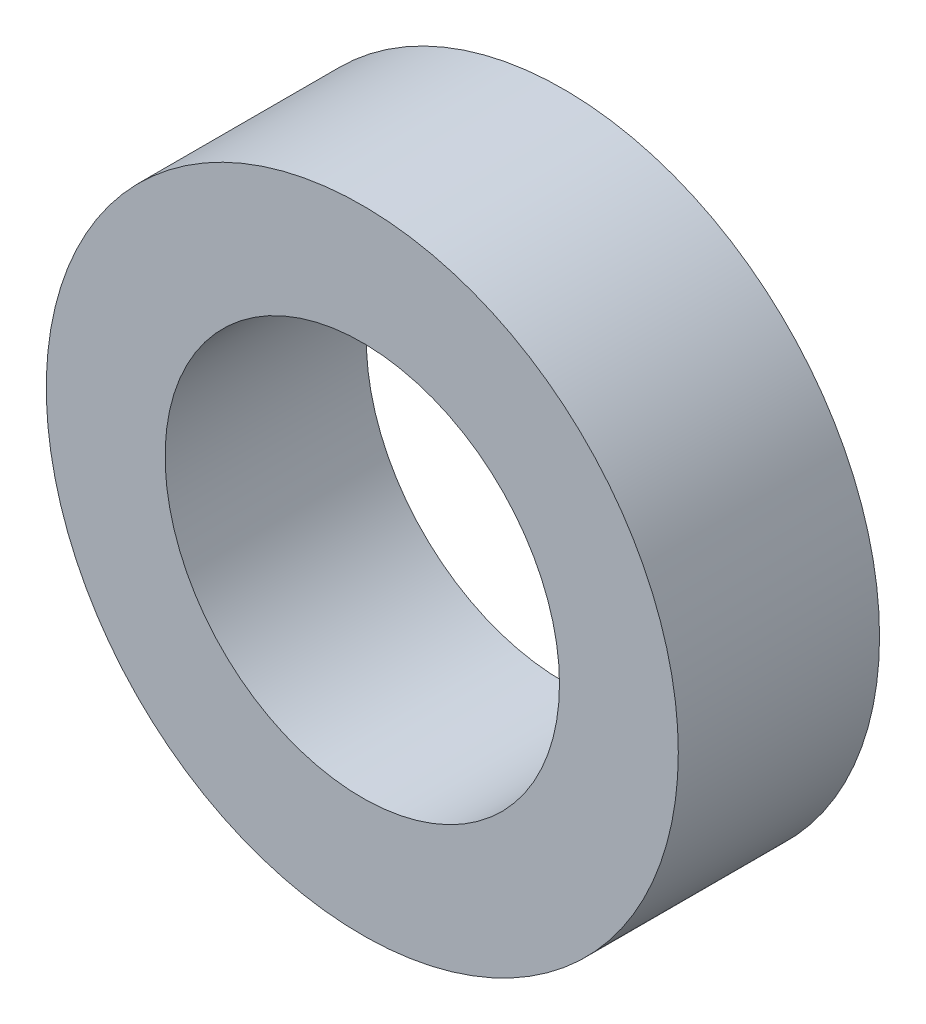
ISO-10303-21;
HEADER;
FILE_DESCRIPTION(('STEP AP214'),'2;1');
FILE_NAME('part.step','',(''),(''),'','','');
FILE_SCHEMA(('AUTOMOTIVE_DESIGN { 1 0 10303 214 1 1 1 1 }'));
ENDSEC;
DATA;
#1=APPLICATION_CONTEXT('core data for automotive mechanical design processes');
#2=APPLICATION_PROTOCOL_DEFINITION('international standard','automotive_design',2000,#1);
#3=PRODUCT_CONTEXT('',#1,'mechanical');
#4=PRODUCT('Part','Part','',(#3));
#5=PRODUCT_RELATED_PRODUCT_CATEGORY('part','',(#4));
#6=PRODUCT_DEFINITION_FORMATION('','',#4);
#7=PRODUCT_DEFINITION_CONTEXT('part definition',#1,'design');
#8=PRODUCT_DEFINITION('design','',#6,#7);
#9=PRODUCT_DEFINITION_SHAPE('','',#8);
#10=(LENGTH_UNIT() NAMED_UNIT(*) SI_UNIT(.MILLI.,.METRE.));
#11=(NAMED_UNIT(*) PLANE_ANGLE_UNIT() SI_UNIT($,.RADIAN.));
#12=(NAMED_UNIT(*) SI_UNIT($,.STERADIAN.) SOLID_ANGLE_UNIT());
#13=UNCERTAINTY_MEASURE_WITH_UNIT(LENGTH_MEASURE(1.E-05),#10,'distance_accuracy_value','');
#14=(GEOMETRIC_REPRESENTATION_CONTEXT(3) GLOBAL_UNCERTAINTY_ASSIGNED_CONTEXT((#13)) GLOBAL_UNIT_ASSIGNED_CONTEXT((#10,
#11,#12)) REPRESENTATION_CONTEXT('',''));
#15=CARTESIAN_POINT('',(0.,0.,0.));
#16=DIRECTION('',(0.,0.,1.));
#17=DIRECTION('',(1.,0.,0.));
#18=AXIS2_PLACEMENT_3D('',#15,#16,#17);
#19=CARTESIAN_POINT('',(0.,0.,10.1092));
#20=DIRECTION('',(0.,0.,1.));
#21=DIRECTION('',(1.,0.,0.));
#22=AXIS2_PLACEMENT_3D('',#19,#20,#21);
#23=PLANE('',#22);
#24=CARTESIAN_POINT('',(0.,0.,10.1092));
#25=DIRECTION('',(0.,0.,1.));
#26=DIRECTION('',(1.,0.,0.));
#27=AXIS2_PLACEMENT_3D('',#24,#25,#26);
#28=CIRCLE('',#27,15.875);
#29=CARTESIAN_POINT('',(15.875,0.,10.1092));
#30=VERTEX_POINT('',#29);
#31=EDGE_CURVE('E10',#30,#30,#28,.T.);
#32=ORIENTED_EDGE('',*,*,#31,.T.);
#33=EDGE_LOOP('',(#32));
#34=FACE_BOUND('',#33,.T.);
#35=CARTESIAN_POINT('',(0.,0.,10.1092));
#36=DIRECTION('',(0.,0.,1.));
#37=DIRECTION('',(1.,0.,0.));
#38=AXIS2_PLACEMENT_3D('',#35,#36,#37);
#39=CIRCLE('',#38,9.906);
#40=CARTESIAN_POINT('',(9.906,0.,10.1092));
#41=VERTEX_POINT('',#40);
#42=EDGE_CURVE('E56',#41,#41,#39,.T.);
#43=ORIENTED_EDGE('',*,*,#42,.F.);
#44=EDGE_LOOP('',(#43));
#45=FACE_BOUND('',#44,.T.);
#46=ADVANCED_FACE('F43',(#34,#45),#23,.T.);
#47=CARTESIAN_POINT('',(0.,0.,0.));
#48=DIRECTION('',(0.,0.,1.));
#49=DIRECTION('',(1.,0.,0.));
#50=AXIS2_PLACEMENT_3D('',#47,#48,#49);
#51=PLANE('',#50);
#52=CARTESIAN_POINT('',(0.,0.,0.));
#53=DIRECTION('',(0.,0.,1.));
#54=DIRECTION('',(1.,0.,0.));
#55=AXIS2_PLACEMENT_3D('',#52,#53,#54);
#56=CIRCLE('',#55,15.875);
#57=CARTESIAN_POINT('',(15.875,0.,0.));
#58=VERTEX_POINT('',#57);
#59=EDGE_CURVE('E47',#58,#58,#56,.T.);
#60=ORIENTED_EDGE('',*,*,#59,.F.);
#61=EDGE_LOOP('',(#60));
#62=FACE_BOUND('',#61,.T.);
#63=CARTESIAN_POINT('',(0.,0.,0.));
#64=DIRECTION('',(0.,0.,1.));
#65=DIRECTION('',(1.,0.,0.));
#66=AXIS2_PLACEMENT_3D('',#63,#64,#65);
#67=CIRCLE('',#66,9.906);
#68=CARTESIAN_POINT('',(9.906,0.,0.));
#69=VERTEX_POINT('',#68);
#70=EDGE_CURVE('E58',#69,#69,#67,.T.);
#71=ORIENTED_EDGE('',*,*,#70,.T.);
#72=EDGE_LOOP('',(#71));
#73=FACE_BOUND('',#72,.T.);
#74=ADVANCED_FACE('F70',(#62,#73),#51,.F.);
#75=CARTESIAN_POINT('',(0.,0.,10.1092));
#76=DIRECTION('',(0.,0.,-1.));
#77=DIRECTION('',(-1.,0.,0.));
#78=AXIS2_PLACEMENT_3D('',#75,#76,#77);
#79=CYLINDRICAL_SURFACE('',#78,15.875);
#80=ORIENTED_EDGE('',*,*,#31,.F.);
#81=EDGE_LOOP('',(#80));
#82=FACE_BOUND('',#81,.T.);
#83=ORIENTED_EDGE('',*,*,#59,.T.);
#84=EDGE_LOOP('',(#83));
#85=FACE_BOUND('',#84,.T.);
#86=ADVANCED_FACE('F45',(#82,#85),#79,.T.);
#87=CARTESIAN_POINT('',(0.,0.,10.1092));
#88=DIRECTION('',(0.,0.,-1.));
#89=DIRECTION('',(-1.,0.,0.));
#90=AXIS2_PLACEMENT_3D('',#87,#88,#89);
#91=CYLINDRICAL_SURFACE('',#90,9.906);
#92=ORIENTED_EDGE('',*,*,#42,.T.);
#93=EDGE_LOOP('',(#92));
#94=FACE_BOUND('',#93,.T.);
#95=ORIENTED_EDGE('',*,*,#70,.F.);
#96=EDGE_LOOP('',(#95));
#97=FACE_BOUND('',#96,.T.);
#98=ADVANCED_FACE('F66',(#94,#97),#91,.F.);
#99=CLOSED_SHELL('',(#46,#74,#86,#98));
#100=MANIFOLD_SOLID_BREP('B2',#99);
#101=ADVANCED_BREP_SHAPE_REPRESENTATION('',(#18,#100),#14);
#102=SHAPE_DEFINITION_REPRESENTATION(#9,#101);
ENDSEC;
END-ISO-10303-21;
